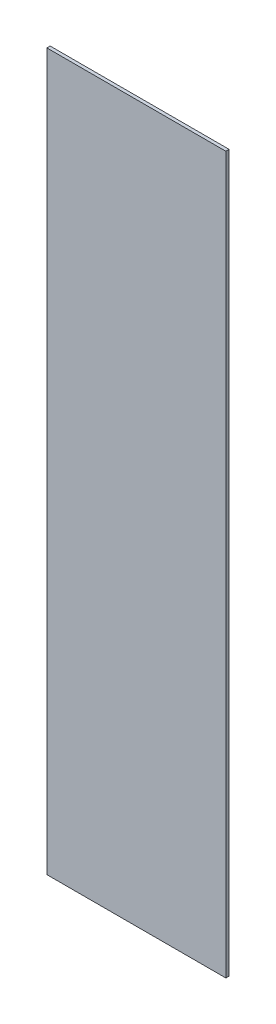
ISO-10303-21;
HEADER;
FILE_DESCRIPTION(('STEP AP214'),'2;1');
FILE_NAME('part.step','',(''),(''),'','','');
FILE_SCHEMA(('AUTOMOTIVE_DESIGN { 1 0 10303 214 1 1 1 1 }'));
ENDSEC;
DATA;
#1=APPLICATION_CONTEXT('core data for automotive mechanical design processes');
#2=APPLICATION_PROTOCOL_DEFINITION('international standard','automotive_design',2000,#1);
#3=PRODUCT_CONTEXT('',#1,'mechanical');
#4=PRODUCT('Part','Part','',(#3));
#5=PRODUCT_RELATED_PRODUCT_CATEGORY('part','',(#4));
#6=PRODUCT_DEFINITION_FORMATION('','',#4);
#7=PRODUCT_DEFINITION_CONTEXT('part definition',#1,'design');
#8=PRODUCT_DEFINITION('design','',#6,#7);
#9=PRODUCT_DEFINITION_SHAPE('','',#8);
#10=(LENGTH_UNIT() NAMED_UNIT(*) SI_UNIT(.MILLI.,.METRE.));
#11=(NAMED_UNIT(*) PLANE_ANGLE_UNIT() SI_UNIT($,.RADIAN.));
#12=(NAMED_UNIT(*) SI_UNIT($,.STERADIAN.) SOLID_ANGLE_UNIT());
#13=UNCERTAINTY_MEASURE_WITH_UNIT(LENGTH_MEASURE(1.E-05),#10,'distance_accuracy_value','');
#14=(GEOMETRIC_REPRESENTATION_CONTEXT(3) GLOBAL_UNCERTAINTY_ASSIGNED_CONTEXT((#13)) GLOBAL_UNIT_ASSIGNED_CONTEXT((#10,
#11,#12)) REPRESENTATION_CONTEXT('',''));
#15=CARTESIAN_POINT('',(0.,0.,0.));
#16=DIRECTION('',(0.,0.,1.));
#17=DIRECTION('',(1.,0.,0.));
#18=AXIS2_PLACEMENT_3D('',#15,#16,#17);
#19=CARTESIAN_POINT('',(0.,0.,11.1125));
#20=DIRECTION('',(1.,0.,0.));
#21=DIRECTION('',(0.,0.,-1.));
#22=AXIS2_PLACEMENT_3D('',#19,#20,#21);
#23=PLANE('',#22);
#24=DIRECTION('',(0.,-1.,0.));
#25=VECTOR('',#24,1.);
#26=CARTESIAN_POINT('',(0.,0.,0.));
#27=LINE('',#26,#25);
#28=CARTESIAN_POINT('',(0.,2438.4,0.));
#29=VERTEX_POINT('',#28);
#30=CARTESIAN_POINT('',(0.,0.,0.));
#31=VERTEX_POINT('',#30);
#32=EDGE_CURVE('E98',#29,#31,#27,.T.);
#33=ORIENTED_EDGE('',*,*,#32,.T.);
#34=DIRECTION('',(0.,0.,-1.));
#35=VECTOR('',#34,1.);
#36=CARTESIAN_POINT('',(0.,0.,11.1125));
#37=LINE('',#36,#35);
#38=CARTESIAN_POINT('',(0.,0.,11.1125));
#39=VERTEX_POINT('',#38);
#40=EDGE_CURVE('E11',#39,#31,#37,.T.);
#41=ORIENTED_EDGE('',*,*,#40,.F.);
#42=DIRECTION('',(0.,-1.,0.));
#43=VECTOR('',#42,1.);
#44=CARTESIAN_POINT('',(0.,0.,11.1125));
#45=LINE('',#44,#43);
#46=CARTESIAN_POINT('',(0.,2438.4,11.1125));
#47=VERTEX_POINT('',#46);
#48=EDGE_CURVE('E86',#47,#39,#45,.T.);
#49=ORIENTED_EDGE('',*,*,#48,.F.);
#50=DIRECTION('',(0.,0.,-1.));
#51=VECTOR('',#50,1.);
#52=CARTESIAN_POINT('',(0.,2438.4,11.1125));
#53=LINE('',#52,#51);
#54=EDGE_CURVE('E94',#47,#29,#53,.T.);
#55=ORIENTED_EDGE('',*,*,#54,.T.);
#56=EDGE_LOOP('',(#33,#41,#49,#55));
#57=FACE_BOUND('',#56,.T.);
#58=ADVANCED_FACE('F35',(#57),#23,.F.);
#59=CARTESIAN_POINT('',(0.,0.,11.1125));
#60=DIRECTION('',(0.,1.,0.));
#61=DIRECTION('',(0.,0.,1.));
#62=AXIS2_PLACEMENT_3D('',#59,#60,#61);
#63=PLANE('',#62);
#64=DIRECTION('',(1.,0.,0.));
#65=VECTOR('',#64,1.);
#66=CARTESIAN_POINT('',(0.,0.,0.));
#67=LINE('',#66,#65);
#68=CARTESIAN_POINT('',(609.6,0.,0.));
#69=VERTEX_POINT('',#68);
#70=EDGE_CURVE('E90',#31,#69,#67,.T.);
#71=ORIENTED_EDGE('',*,*,#70,.T.);
#72=DIRECTION('',(0.,0.,-1.));
#73=VECTOR('',#72,1.);
#74=CARTESIAN_POINT('',(609.6,0.,11.1125));
#75=LINE('',#74,#73);
#76=CARTESIAN_POINT('',(609.6,0.,11.1125));
#77=VERTEX_POINT('',#76);
#78=EDGE_CURVE('E43',#77,#69,#75,.T.);
#79=ORIENTED_EDGE('',*,*,#78,.F.);
#80=DIRECTION('',(1.,0.,0.));
#81=VECTOR('',#80,1.);
#82=CARTESIAN_POINT('',(0.,0.,11.1125));
#83=LINE('',#82,#81);
#84=EDGE_CURVE('E81',#39,#77,#83,.T.);
#85=ORIENTED_EDGE('',*,*,#84,.F.);
#86=ORIENTED_EDGE('',*,*,#40,.T.);
#87=EDGE_LOOP('',(#71,#79,#85,#86));
#88=FACE_BOUND('',#87,.T.);
#89=ADVANCED_FACE('F89',(#88),#63,.F.);
#90=CARTESIAN_POINT('',(609.6,0.,11.1125));
#91=DIRECTION('',(-1.,0.,0.));
#92=DIRECTION('',(0.,0.,1.));
#93=AXIS2_PLACEMENT_3D('',#90,#91,#92);
#94=PLANE('',#93);
#95=DIRECTION('',(0.,1.,0.));
#96=VECTOR('',#95,1.);
#97=CARTESIAN_POINT('',(609.6,0.,0.));
#98=LINE('',#97,#96);
#99=CARTESIAN_POINT('',(609.6,2438.4,0.));
#100=VERTEX_POINT('',#99);
#101=EDGE_CURVE('E68',#69,#100,#98,.T.);
#102=ORIENTED_EDGE('',*,*,#101,.T.);
#103=DIRECTION('',(0.,0.,-1.));
#104=VECTOR('',#103,1.);
#105=CARTESIAN_POINT('',(609.6,2438.4,11.1125));
#106=LINE('',#105,#104);
#107=CARTESIAN_POINT('',(609.6,2438.4,11.1125));
#108=VERTEX_POINT('',#107);
#109=EDGE_CURVE('E91',#108,#100,#106,.T.);
#110=ORIENTED_EDGE('',*,*,#109,.F.);
#111=DIRECTION('',(0.,1.,0.));
#112=VECTOR('',#111,1.);
#113=CARTESIAN_POINT('',(609.6,0.,11.1125));
#114=LINE('',#113,#112);
#115=EDGE_CURVE('E84',#77,#108,#114,.T.);
#116=ORIENTED_EDGE('',*,*,#115,.F.);
#117=ORIENTED_EDGE('',*,*,#78,.T.);
#118=EDGE_LOOP('',(#102,#110,#116,#117));
#119=FACE_BOUND('',#118,.T.);
#120=ADVANCED_FACE('F92',(#119),#94,.F.);
#121=CARTESIAN_POINT('',(0.,2438.4,11.1125));
#122=DIRECTION('',(0.,-1.,0.));
#123=DIRECTION('',(0.,0.,-1.));
#124=AXIS2_PLACEMENT_3D('',#121,#122,#123);
#125=PLANE('',#124);
#126=DIRECTION('',(-1.,0.,0.));
#127=VECTOR('',#126,1.);
#128=CARTESIAN_POINT('',(0.,2438.4,0.));
#129=LINE('',#128,#127);
#130=EDGE_CURVE('E74',#100,#29,#129,.T.);
#131=ORIENTED_EDGE('',*,*,#130,.T.);
#132=ORIENTED_EDGE('',*,*,#54,.F.);
#133=DIRECTION('',(-1.,0.,0.));
#134=VECTOR('',#133,1.);
#135=CARTESIAN_POINT('',(0.,2438.4,11.1125));
#136=LINE('',#135,#134);
#137=EDGE_CURVE('E51',#108,#47,#136,.T.);
#138=ORIENTED_EDGE('',*,*,#137,.F.);
#139=ORIENTED_EDGE('',*,*,#109,.T.);
#140=EDGE_LOOP('',(#131,#132,#138,#139));
#141=FACE_BOUND('',#140,.T.);
#142=ADVANCED_FACE('F105',(#141),#125,.F.);
#143=CARTESIAN_POINT('',(0.,0.,11.1125));
#144=DIRECTION('',(0.,0.,-1.));
#145=DIRECTION('',(-1.,0.,0.));
#146=AXIS2_PLACEMENT_3D('',#143,#144,#145);
#147=PLANE('',#146);
#148=ORIENTED_EDGE('',*,*,#48,.T.);
#149=ORIENTED_EDGE('',*,*,#84,.T.);
#150=ORIENTED_EDGE('',*,*,#115,.T.);
#151=ORIENTED_EDGE('',*,*,#137,.T.);
#152=EDGE_LOOP('',(#148,#149,#150,#151));
#153=FACE_BOUND('',#152,.T.);
#154=ADVANCED_FACE('F82',(#153),#147,.F.);
#155=CARTESIAN_POINT('',(0.,0.,0.));
#156=DIRECTION('',(0.,0.,-1.));
#157=DIRECTION('',(-1.,0.,0.));
#158=AXIS2_PLACEMENT_3D('',#155,#156,#157);
#159=PLANE('',#158);
#160=ORIENTED_EDGE('',*,*,#32,.F.);
#161=ORIENTED_EDGE('',*,*,#130,.F.);
#162=ORIENTED_EDGE('',*,*,#101,.F.);
#163=ORIENTED_EDGE('',*,*,#70,.F.);
#164=EDGE_LOOP('',(#160,#161,#162,#163));
#165=FACE_BOUND('',#164,.T.);
#166=ADVANCED_FACE('F108',(#165),#159,.T.);
#167=CLOSED_SHELL('',(#58,#89,#120,#142,#154,#166));
#168=MANIFOLD_SOLID_BREP('B2',#167);
#169=ADVANCED_BREP_SHAPE_REPRESENTATION('',(#18,#168),#14);
#170=SHAPE_DEFINITION_REPRESENTATION(#9,#169);
ENDSEC;
END-ISO-10303-21;
